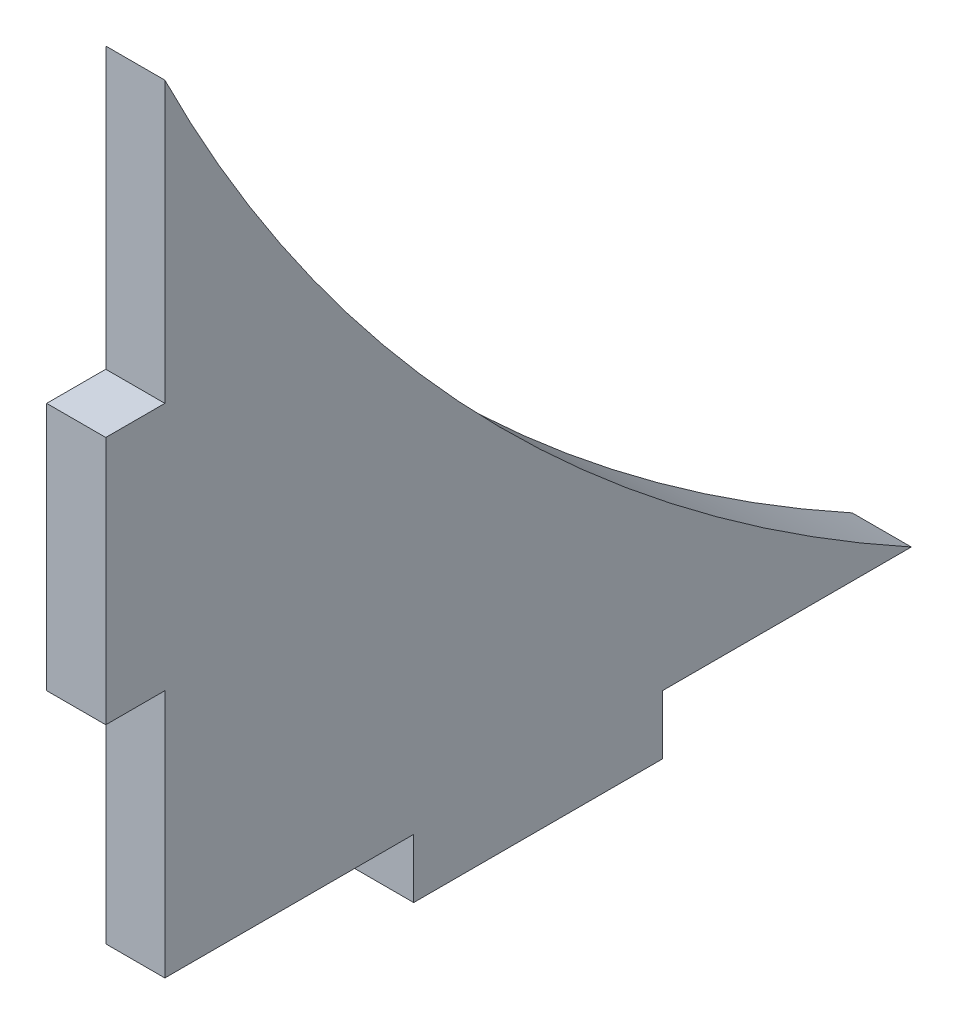
ISO-10303-21;
HEADER;
FILE_DESCRIPTION(('STEP AP214'),'2;1');
FILE_NAME('part.step','',(''),(''),'','','');
FILE_SCHEMA(('AUTOMOTIVE_DESIGN { 1 0 10303 214 1 1 1 1 }'));
ENDSEC;
DATA;
#1=APPLICATION_CONTEXT('core data for automotive mechanical design processes');
#2=APPLICATION_PROTOCOL_DEFINITION('international standard','automotive_design',2000,#1);
#3=PRODUCT_CONTEXT('',#1,'mechanical');
#4=PRODUCT('Part','Part','',(#3));
#5=PRODUCT_RELATED_PRODUCT_CATEGORY('part','',(#4));
#6=PRODUCT_DEFINITION_FORMATION('','',#4);
#7=PRODUCT_DEFINITION_CONTEXT('part definition',#1,'design');
#8=PRODUCT_DEFINITION('design','',#6,#7);
#9=PRODUCT_DEFINITION_SHAPE('','',#8);
#10=(LENGTH_UNIT() NAMED_UNIT(*) SI_UNIT(.MILLI.,.METRE.));
#11=(NAMED_UNIT(*) PLANE_ANGLE_UNIT() SI_UNIT($,.RADIAN.));
#12=(NAMED_UNIT(*) SI_UNIT($,.STERADIAN.) SOLID_ANGLE_UNIT());
#13=UNCERTAINTY_MEASURE_WITH_UNIT(LENGTH_MEASURE(1.E-05),#10,'distance_accuracy_value','');
#14=(GEOMETRIC_REPRESENTATION_CONTEXT(3) GLOBAL_UNCERTAINTY_ASSIGNED_CONTEXT((#13)) GLOBAL_UNIT_ASSIGNED_CONTEXT((#10,
#11,#12)) REPRESENTATION_CONTEXT('',''));
#15=CARTESIAN_POINT('',(0.,0.,0.));
#16=DIRECTION('',(0.,0.,1.));
#17=DIRECTION('',(1.,0.,0.));
#18=AXIS2_PLACEMENT_3D('',#15,#16,#17);
#19=CARTESIAN_POINT('',(19.,109.432234432234,143.772893772894));
#20=DIRECTION('',(0.,0.,-1.));
#21=DIRECTION('',(-1.,0.,0.));
#22=AXIS2_PLACEMENT_3D('',#19,#20,#21);
#23=PLANE('',#22);
#24=DIRECTION('',(-1.,0.,0.));
#25=VECTOR('',#24,1.);
#26=CARTESIAN_POINT('',(0.,19.4322344322344,143.772893772894));
#27=LINE('',#26,#25);
#28=CARTESIAN_POINT('',(19.,19.4322344322344,143.772893772894));
#29=VERTEX_POINT('',#28);
#30=CARTESIAN_POINT('',(0.,19.4322344322344,143.772893772894));
#31=VERTEX_POINT('',#30);
#32=EDGE_CURVE('E48',#29,#31,#27,.T.);
#33=ORIENTED_EDGE('',*,*,#32,.F.);
#34=DIRECTION('',(0.,-1.,0.));
#35=VECTOR('',#34,1.);
#36=CARTESIAN_POINT('',(19.,109.432234432234,143.772893772894));
#37=LINE('',#36,#35);
#38=CARTESIAN_POINT('',(19.,109.432234432234,143.772893772894));
#39=VERTEX_POINT('',#38);
#40=EDGE_CURVE('E178',#39,#29,#37,.T.);
#41=ORIENTED_EDGE('',*,*,#40,.F.);
#42=DIRECTION('',(-1.,0.,0.));
#43=VECTOR('',#42,1.);
#44=CARTESIAN_POINT('',(19.,109.432234432234,143.772893772894));
#45=LINE('',#44,#43);
#46=CARTESIAN_POINT('',(0.,109.432234432234,143.772893772894));
#47=VERTEX_POINT('',#46);
#48=EDGE_CURVE('E11',#39,#47,#45,.T.);
#49=ORIENTED_EDGE('',*,*,#48,.T.);
#50=DIRECTION('',(0.,-1.,0.));
#51=VECTOR('',#50,1.);
#52=CARTESIAN_POINT('',(0.,109.432234432234,143.772893772894));
#53=LINE('',#52,#51);
#54=EDGE_CURVE('E187',#47,#31,#53,.T.);
#55=ORIENTED_EDGE('',*,*,#54,.T.);
#56=EDGE_LOOP('',(#33,#41,#49,#55));
#57=FACE_BOUND('',#56,.T.);
#58=ADVANCED_FACE('F33',(#57),#23,.F.);
#59=DIRECTION('',(1.,0.,0.));
#60=VECTOR('',#59,1.);
#61=CARTESIAN_POINT('',(0.,-60.5677655677656,143.772893772894));
#62=LINE('',#61,#60);
#63=CARTESIAN_POINT('',(0.,-60.5677655677656,143.772893772894));
#64=VERTEX_POINT('',#63);
#65=CARTESIAN_POINT('',(19.,-60.5677655677656,143.772893772894));
#66=VERTEX_POINT('',#65);
#67=EDGE_CURVE('E56',#64,#66,#62,.T.);
#68=ORIENTED_EDGE('',*,*,#67,.F.);
#69=CARTESIAN_POINT('',(0.,-140.567765567766,143.772893772894));
#70=VERTEX_POINT('',#69);
#71=EDGE_CURVE('E139',#64,#70,#53,.T.);
#72=ORIENTED_EDGE('',*,*,#71,.T.);
#73=DIRECTION('',(-1.,0.,0.));
#74=VECTOR('',#73,1.);
#75=CARTESIAN_POINT('',(19.,-140.567765567766,143.772893772894));
#76=LINE('',#75,#74);
#77=CARTESIAN_POINT('',(19.,-140.567765567766,143.772893772894));
#78=VERTEX_POINT('',#77);
#79=EDGE_CURVE('E41',#78,#70,#76,.T.);
#80=ORIENTED_EDGE('',*,*,#79,.F.);
#81=EDGE_CURVE('E176',#66,#78,#37,.T.);
#82=ORIENTED_EDGE('',*,*,#81,.F.);
#83=EDGE_LOOP('',(#68,#72,#80,#82));
#84=FACE_BOUND('',#83,.T.);
#85=ADVANCED_FACE('F207',(#84),#23,.F.);
#86=CARTESIAN_POINT('',(19.,-140.567765567766,143.772893772894));
#87=DIRECTION('',(0.,1.,0.));
#88=DIRECTION('',(0.,0.,1.));
#89=AXIS2_PLACEMENT_3D('',#86,#87,#88);
#90=PLANE('',#89);
#91=DIRECTION('',(-1.,0.,0.));
#92=VECTOR('',#91,1.);
#93=CARTESIAN_POINT('',(0.,-140.567765567766,63.7728937728938));
#94=LINE('',#93,#92);
#95=CARTESIAN_POINT('',(19.,-140.567765567766,63.7728937728938));
#96=VERTEX_POINT('',#95);
#97=CARTESIAN_POINT('',(0.,-140.567765567766,63.7728937728938));
#98=VERTEX_POINT('',#97);
#99=EDGE_CURVE('E143',#96,#98,#94,.T.);
#100=ORIENTED_EDGE('',*,*,#99,.F.);
#101=DIRECTION('',(0.,0.,-1.));
#102=VECTOR('',#101,1.);
#103=CARTESIAN_POINT('',(19.,-140.567765567766,143.772893772894));
#104=LINE('',#103,#102);
#105=EDGE_CURVE('E181',#78,#96,#104,.T.);
#106=ORIENTED_EDGE('',*,*,#105,.F.);
#107=ORIENTED_EDGE('',*,*,#79,.T.);
#108=DIRECTION('',(0.,0.,-1.));
#109=VECTOR('',#108,1.);
#110=CARTESIAN_POINT('',(0.,-140.567765567766,143.772893772894));
#111=LINE('',#110,#109);
#112=EDGE_CURVE('E177',#70,#98,#111,.T.);
#113=ORIENTED_EDGE('',*,*,#112,.T.);
#114=EDGE_LOOP('',(#100,#106,#107,#113));
#115=FACE_BOUND('',#114,.T.);
#116=ADVANCED_FACE('F196',(#115),#90,.F.);
#117=DIRECTION('',(1.,0.,0.));
#118=VECTOR('',#117,1.);
#119=CARTESIAN_POINT('',(0.,-140.567765567766,-16.2271062271062));
#120=LINE('',#119,#118);
#121=CARTESIAN_POINT('',(0.,-140.567765567766,-16.2271062271062));
#122=VERTEX_POINT('',#121);
#123=CARTESIAN_POINT('',(19.,-140.567765567766,-16.2271062271062));
#124=VERTEX_POINT('',#123);
#125=EDGE_CURVE('E140',#122,#124,#120,.T.);
#126=ORIENTED_EDGE('',*,*,#125,.F.);
#127=CARTESIAN_POINT('',(0.,-140.567765567766,-96.2271062271062));
#128=VERTEX_POINT('',#127);
#129=EDGE_CURVE('E189',#122,#128,#111,.T.);
#130=ORIENTED_EDGE('',*,*,#129,.T.);
#131=DIRECTION('',(-1.,0.,0.));
#132=VECTOR('',#131,1.);
#133=CARTESIAN_POINT('',(19.,-140.567765567766,-96.2271062271062));
#134=LINE('',#133,#132);
#135=CARTESIAN_POINT('',(19.,-140.567765567766,-96.2271062271062));
#136=VERTEX_POINT('',#135);
#137=EDGE_CURVE('E184',#136,#128,#134,.T.);
#138=ORIENTED_EDGE('',*,*,#137,.F.);
#139=EDGE_CURVE('E180',#124,#136,#104,.T.);
#140=ORIENTED_EDGE('',*,*,#139,.F.);
#141=EDGE_LOOP('',(#126,#130,#138,#140));
#142=FACE_BOUND('',#141,.T.);
#143=ADVANCED_FACE('F229',(#142),#90,.F.);
#144=CARTESIAN_POINT('',(19.,366.150031194915,-373.849811188232));
#145=DIRECTION('',(-1.,0.,0.));
#146=DIRECTION('',(0.,0.,1.));
#147=AXIS2_PLACEMENT_3D('',#144,#145,#146);
#148=CYLINDRICAL_SURFACE('',#147,577.786545244831);
#149=CARTESIAN_POINT('',(0.,366.150031194915,-373.849811188232));
#150=DIRECTION('',(-1.,0.,0.));
#151=DIRECTION('',(0.,0.,-1.));
#152=AXIS2_PLACEMENT_3D('',#149,#150,#151);
#153=CIRCLE('',#152,577.786545244831);
#154=EDGE_CURVE('E172',#128,#47,#153,.T.);
#155=ORIENTED_EDGE('',*,*,#154,.T.);
#156=ORIENTED_EDGE('',*,*,#48,.F.);
#157=CARTESIAN_POINT('',(19.,366.150031194915,-373.849811188232));
#158=DIRECTION('',(-1.,0.,0.));
#159=DIRECTION('',(0.,0.,-1.));
#160=AXIS2_PLACEMENT_3D('',#157,#158,#159);
#161=CIRCLE('',#160,577.786545244831);
#162=EDGE_CURVE('E173',#136,#39,#161,.T.);
#163=ORIENTED_EDGE('',*,*,#162,.F.);
#164=ORIENTED_EDGE('',*,*,#137,.T.);
#165=EDGE_LOOP('',(#155,#156,#163,#164));
#166=FACE_BOUND('',#165,.T.);
#167=ADVANCED_FACE('F35',(#166),#148,.F.);
#168=CARTESIAN_POINT('',(19.,366.150031194915,-373.849811188232));
#169=DIRECTION('',(1.,0.,0.));
#170=DIRECTION('',(0.,0.,-1.));
#171=AXIS2_PLACEMENT_3D('',#168,#169,#170);
#172=PLANE('',#171);
#173=ORIENTED_EDGE('',*,*,#162,.T.);
#174=ORIENTED_EDGE('',*,*,#40,.T.);
#175=DIRECTION('',(0.,0.,-1.));
#176=VECTOR('',#175,1.);
#177=CARTESIAN_POINT('',(19.,19.4322344322344,162.772893772894));
#178=LINE('',#177,#176);
#179=CARTESIAN_POINT('',(19.,19.4322344322344,162.772893772894));
#180=VERTEX_POINT('',#179);
#181=EDGE_CURVE('E145',#180,#29,#178,.T.);
#182=ORIENTED_EDGE('',*,*,#181,.F.);
#183=DIRECTION('',(0.,1.,0.));
#184=VECTOR('',#183,1.);
#185=CARTESIAN_POINT('',(19.,19.4322344322344,162.772893772894));
#186=LINE('',#185,#184);
#187=CARTESIAN_POINT('',(19.,-60.5677655677656,162.772893772894));
#188=VERTEX_POINT('',#187);
#189=EDGE_CURVE('E125',#188,#180,#186,.T.);
#190=ORIENTED_EDGE('',*,*,#189,.F.);
#191=DIRECTION('',(0.,0.,-1.));
#192=VECTOR('',#191,1.);
#193=CARTESIAN_POINT('',(19.,-60.5677655677656,162.772893772894));
#194=LINE('',#193,#192);
#195=EDGE_CURVE('E122',#188,#66,#194,.T.);
#196=ORIENTED_EDGE('',*,*,#195,.T.);
#197=ORIENTED_EDGE('',*,*,#81,.T.);
#198=ORIENTED_EDGE('',*,*,#105,.T.);
#199=DIRECTION('',(0.,1.,0.));
#200=VECTOR('',#199,1.);
#201=CARTESIAN_POINT('',(19.,-159.567765567766,63.7728937728938));
#202=LINE('',#201,#200);
#203=CARTESIAN_POINT('',(19.,-159.567765567766,63.7728937728938));
#204=VERTEX_POINT('',#203);
#205=EDGE_CURVE('E163',#204,#96,#202,.T.);
#206=ORIENTED_EDGE('',*,*,#205,.F.);
#207=DIRECTION('',(0.,0.,1.));
#208=VECTOR('',#207,1.);
#209=CARTESIAN_POINT('',(19.,-159.567765567766,63.7728937728938));
#210=LINE('',#209,#208);
#211=CARTESIAN_POINT('',(19.,-159.567765567766,-16.2271062271062));
#212=VERTEX_POINT('',#211);
#213=EDGE_CURVE('E154',#212,#204,#210,.T.);
#214=ORIENTED_EDGE('',*,*,#213,.F.);
#215=DIRECTION('',(0.,1.,0.));
#216=VECTOR('',#215,1.);
#217=CARTESIAN_POINT('',(19.,-159.567765567766,-16.2271062271062));
#218=LINE('',#217,#216);
#219=EDGE_CURVE('E166',#212,#124,#218,.T.);
#220=ORIENTED_EDGE('',*,*,#219,.T.);
#221=ORIENTED_EDGE('',*,*,#139,.T.);
#222=EDGE_LOOP('',(#173,#174,#182,#190,#196,#197,#198,#206,#214,#220,#221));
#223=FACE_BOUND('',#222,.T.);
#224=ADVANCED_FACE('F205',(#223),#172,.T.);
#225=CARTESIAN_POINT('',(0.,366.150031194915,-373.849811188232));
#226=DIRECTION('',(1.,0.,0.));
#227=DIRECTION('',(0.,0.,-1.));
#228=AXIS2_PLACEMENT_3D('',#225,#226,#227);
#229=PLANE('',#228);
#230=ORIENTED_EDGE('',*,*,#154,.F.);
#231=ORIENTED_EDGE('',*,*,#129,.F.);
#232=DIRECTION('',(0.,1.,0.));
#233=VECTOR('',#232,1.);
#234=CARTESIAN_POINT('',(0.,-159.567765567766,-16.2271062271062));
#235=LINE('',#234,#233);
#236=CARTESIAN_POINT('',(0.,-159.567765567766,-16.2271062271062));
#237=VERTEX_POINT('',#236);
#238=EDGE_CURVE('E169',#237,#122,#235,.T.);
#239=ORIENTED_EDGE('',*,*,#238,.F.);
#240=DIRECTION('',(0.,0.,-1.));
#241=VECTOR('',#240,1.);
#242=CARTESIAN_POINT('',(0.,-159.567765567766,63.7728937728938));
#243=LINE('',#242,#241);
#244=CARTESIAN_POINT('',(0.,-159.567765567766,63.7728937728938));
#245=VERTEX_POINT('',#244);
#246=EDGE_CURVE('E149',#245,#237,#243,.T.);
#247=ORIENTED_EDGE('',*,*,#246,.F.);
#248=DIRECTION('',(0.,1.,0.));
#249=VECTOR('',#248,1.);
#250=CARTESIAN_POINT('',(0.,-159.567765567766,63.7728937728938));
#251=LINE('',#250,#249);
#252=EDGE_CURVE('E157',#245,#98,#251,.T.);
#253=ORIENTED_EDGE('',*,*,#252,.T.);
#254=ORIENTED_EDGE('',*,*,#112,.F.);
#255=ORIENTED_EDGE('',*,*,#71,.F.);
#256=DIRECTION('',(0.,0.,-1.));
#257=VECTOR('',#256,1.);
#258=CARTESIAN_POINT('',(0.,-60.5677655677656,162.772893772894));
#259=LINE('',#258,#257);
#260=CARTESIAN_POINT('',(0.,-60.5677655677656,162.772893772894));
#261=VERTEX_POINT('',#260);
#262=EDGE_CURVE('E120',#261,#64,#259,.T.);
#263=ORIENTED_EDGE('',*,*,#262,.F.);
#264=DIRECTION('',(0.,-1.,0.));
#265=VECTOR('',#264,1.);
#266=CARTESIAN_POINT('',(0.,19.4322344322344,162.772893772894));
#267=LINE('',#266,#265);
#268=CARTESIAN_POINT('',(0.,19.4322344322344,162.772893772894));
#269=VERTEX_POINT('',#268);
#270=EDGE_CURVE('E126',#269,#261,#267,.T.);
#271=ORIENTED_EDGE('',*,*,#270,.F.);
#272=DIRECTION('',(0.,0.,-1.));
#273=VECTOR('',#272,1.);
#274=CARTESIAN_POINT('',(0.,19.4322344322344,162.772893772894));
#275=LINE('',#274,#273);
#276=EDGE_CURVE('E213',#269,#31,#275,.T.);
#277=ORIENTED_EDGE('',*,*,#276,.T.);
#278=ORIENTED_EDGE('',*,*,#54,.F.);
#279=EDGE_LOOP('',(#230,#231,#239,#247,#253,#254,#255,#263,#271,#277,#278));
#280=FACE_BOUND('',#279,.T.);
#281=ADVANCED_FACE('F137',(#280),#229,.F.);
#282=CARTESIAN_POINT('',(0.,-159.567765567766,-16.2271062271062));
#283=DIRECTION('',(0.,0.,1.));
#284=DIRECTION('',(1.,0.,0.));
#285=AXIS2_PLACEMENT_3D('',#282,#283,#284);
#286=PLANE('',#285);
#287=ORIENTED_EDGE('',*,*,#125,.T.);
#288=ORIENTED_EDGE('',*,*,#219,.F.);
#289=DIRECTION('',(1.,0.,0.));
#290=VECTOR('',#289,1.);
#291=CARTESIAN_POINT('',(0.,-159.567765567766,-16.2271062271062));
#292=LINE('',#291,#290);
#293=EDGE_CURVE('E152',#237,#212,#292,.T.);
#294=ORIENTED_EDGE('',*,*,#293,.F.);
#295=ORIENTED_EDGE('',*,*,#238,.T.);
#296=EDGE_LOOP('',(#287,#288,#294,#295));
#297=FACE_BOUND('',#296,.T.);
#298=ADVANCED_FACE('F225',(#297),#286,.F.);
#299=CARTESIAN_POINT('',(0.,-159.567765567766,63.7728937728938));
#300=DIRECTION('',(0.,0.,-1.));
#301=DIRECTION('',(-1.,0.,0.));
#302=AXIS2_PLACEMENT_3D('',#299,#300,#301);
#303=PLANE('',#302);
#304=ORIENTED_EDGE('',*,*,#99,.T.);
#305=ORIENTED_EDGE('',*,*,#252,.F.);
#306=DIRECTION('',(-1.,0.,0.));
#307=VECTOR('',#306,1.);
#308=CARTESIAN_POINT('',(0.,-159.567765567766,63.7728937728938));
#309=LINE('',#308,#307);
#310=EDGE_CURVE('E156',#204,#245,#309,.T.);
#311=ORIENTED_EDGE('',*,*,#310,.F.);
#312=ORIENTED_EDGE('',*,*,#205,.T.);
#313=EDGE_LOOP('',(#304,#305,#311,#312));
#314=FACE_BOUND('',#313,.T.);
#315=ADVANCED_FACE('F202',(#314),#303,.F.);
#316=CARTESIAN_POINT('',(0.,-159.567765567766,0.));
#317=DIRECTION('',(0.,-1.,0.));
#318=DIRECTION('',(0.,0.,-1.));
#319=AXIS2_PLACEMENT_3D('',#316,#317,#318);
#320=PLANE('',#319);
#321=ORIENTED_EDGE('',*,*,#246,.T.);
#322=ORIENTED_EDGE('',*,*,#293,.T.);
#323=ORIENTED_EDGE('',*,*,#213,.T.);
#324=ORIENTED_EDGE('',*,*,#310,.T.);
#325=EDGE_LOOP('',(#321,#322,#323,#324));
#326=FACE_BOUND('',#325,.T.);
#327=ADVANCED_FACE('F228',(#326),#320,.T.);
#328=CARTESIAN_POINT('',(0.,-60.5677655677656,162.772893772894));
#329=DIRECTION('',(0.,1.,0.));
#330=DIRECTION('',(-1.,0.,0.));
#331=AXIS2_PLACEMENT_3D('',#328,#329,#330);
#332=PLANE('',#331);
#333=ORIENTED_EDGE('',*,*,#67,.T.);
#334=ORIENTED_EDGE('',*,*,#195,.F.);
#335=DIRECTION('',(1.,0.,0.));
#336=VECTOR('',#335,1.);
#337=CARTESIAN_POINT('',(0.,-60.5677655677656,162.772893772894));
#338=LINE('',#337,#336);
#339=EDGE_CURVE('E116',#261,#188,#338,.T.);
#340=ORIENTED_EDGE('',*,*,#339,.F.);
#341=ORIENTED_EDGE('',*,*,#262,.T.);
#342=EDGE_LOOP('',(#333,#334,#340,#341));
#343=FACE_BOUND('',#342,.T.);
#344=ADVANCED_FACE('F118',(#343),#332,.F.);
#345=CARTESIAN_POINT('',(0.,19.4322344322344,162.772893772894));
#346=DIRECTION('',(0.,-1.,0.));
#347=DIRECTION('',(0.,0.,-1.));
#348=AXIS2_PLACEMENT_3D('',#345,#346,#347);
#349=PLANE('',#348);
#350=ORIENTED_EDGE('',*,*,#32,.T.);
#351=ORIENTED_EDGE('',*,*,#276,.F.);
#352=DIRECTION('',(-1.,0.,0.));
#353=VECTOR('',#352,1.);
#354=CARTESIAN_POINT('',(0.,19.4322344322344,162.772893772894));
#355=LINE('',#354,#353);
#356=EDGE_CURVE('E131',#180,#269,#355,.T.);
#357=ORIENTED_EDGE('',*,*,#356,.F.);
#358=ORIENTED_EDGE('',*,*,#181,.T.);
#359=EDGE_LOOP('',(#350,#351,#357,#358));
#360=FACE_BOUND('',#359,.T.);
#361=ADVANCED_FACE('F217',(#360),#349,.F.);
#362=CARTESIAN_POINT('',(0.,0.,162.772893772894));
#363=DIRECTION('',(0.,0.,1.));
#364=DIRECTION('',(1.,0.,0.));
#365=AXIS2_PLACEMENT_3D('',#362,#363,#364);
#366=PLANE('',#365);
#367=ORIENTED_EDGE('',*,*,#270,.T.);
#368=ORIENTED_EDGE('',*,*,#339,.T.);
#369=ORIENTED_EDGE('',*,*,#189,.T.);
#370=ORIENTED_EDGE('',*,*,#356,.T.);
#371=EDGE_LOOP('',(#367,#368,#369,#370));
#372=FACE_BOUND('',#371,.T.);
#373=ADVANCED_FACE('F129',(#372),#366,.T.);
#374=CLOSED_SHELL('',(#58,#85,#116,#143,#167,#224,#281,#298,#315,#327,#344,#361,#373));
#375=MANIFOLD_SOLID_BREP('B2',#374);
#376=ADVANCED_BREP_SHAPE_REPRESENTATION('',(#18,#375),#14);
#377=SHAPE_DEFINITION_REPRESENTATION(#9,#376);
ENDSEC;
END-ISO-10303-21;
